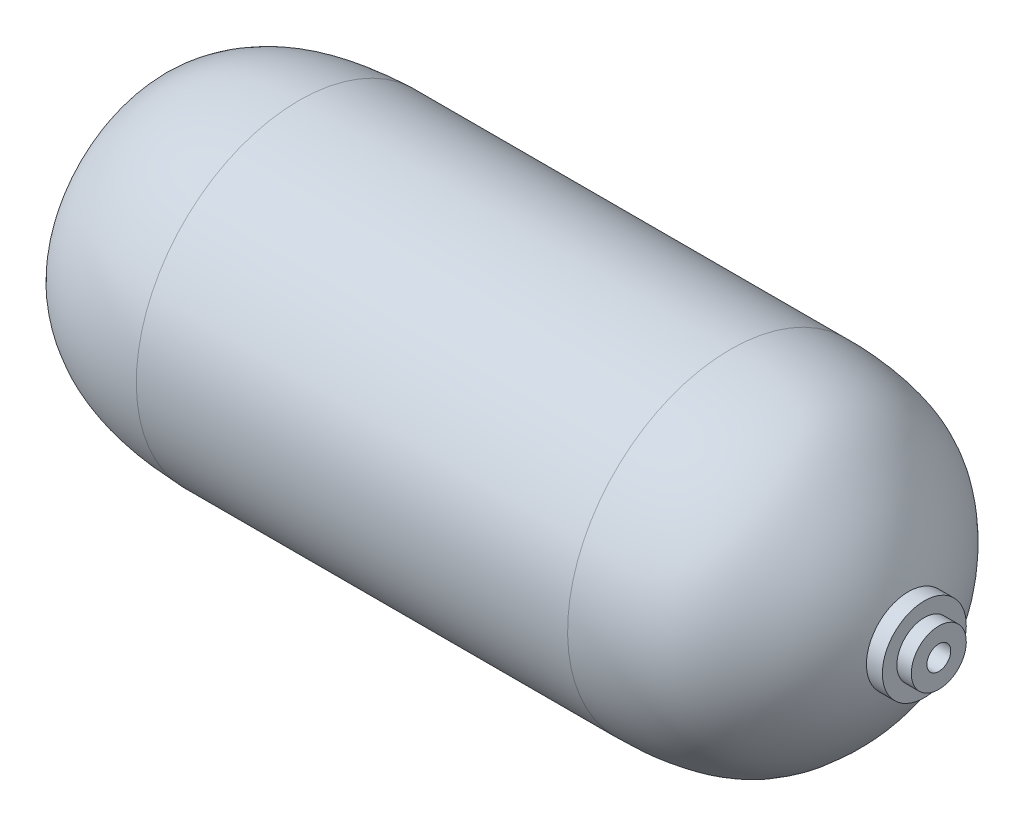
ISO-10303-21;
HEADER;
FILE_DESCRIPTION(('STEP AP214'),'2;1');
FILE_NAME('part.step','',(''),(''),'','','');
FILE_SCHEMA(('AUTOMOTIVE_DESIGN { 1 0 10303 214 1 1 1 1 }'));
ENDSEC;
DATA;
#1=APPLICATION_CONTEXT('core data for automotive mechanical design processes');
#2=APPLICATION_PROTOCOL_DEFINITION('international standard','automotive_design',2000,#1);
#3=PRODUCT_CONTEXT('',#1,'mechanical');
#4=PRODUCT('Part','Part','',(#3));
#5=PRODUCT_RELATED_PRODUCT_CATEGORY('part','',(#4));
#6=PRODUCT_DEFINITION_FORMATION('','',#4);
#7=PRODUCT_DEFINITION_CONTEXT('part definition',#1,'design');
#8=PRODUCT_DEFINITION('design','',#6,#7);
#9=PRODUCT_DEFINITION_SHAPE('','',#8);
#10=(LENGTH_UNIT() NAMED_UNIT(*) SI_UNIT(.MILLI.,.METRE.));
#11=(NAMED_UNIT(*) PLANE_ANGLE_UNIT() SI_UNIT($,.RADIAN.));
#12=(NAMED_UNIT(*) SI_UNIT($,.STERADIAN.) SOLID_ANGLE_UNIT());
#13=UNCERTAINTY_MEASURE_WITH_UNIT(LENGTH_MEASURE(1.E-05),#10,'distance_accuracy_value','');
#14=(GEOMETRIC_REPRESENTATION_CONTEXT(3) GLOBAL_UNCERTAINTY_ASSIGNED_CONTEXT((#13)) GLOBAL_UNIT_ASSIGNED_CONTEXT((#10,
#11,#12)) REPRESENTATION_CONTEXT('',''));
#15=CARTESIAN_POINT('',(0.,0.,0.));
#16=DIRECTION('',(0.,0.,1.));
#17=DIRECTION('',(1.,0.,0.));
#18=AXIS2_PLACEMENT_3D('',#15,#16,#17);
#19=CARTESIAN_POINT('',(528.,0.,0.));
#20=DIRECTION('',(1.,0.,0.));
#21=DIRECTION('',(0.,1.,0.));
#22=AXIS2_PLACEMENT_3D('',#19,#20,#21);
#23=PLANE('',#22);
#24=CARTESIAN_POINT('',(528.,0.,0.));
#25=DIRECTION('',(1.,0.,0.));
#26=DIRECTION('',(0.,1.,0.));
#27=AXIS2_PLACEMENT_3D('',#24,#25,#26);
#28=CIRCLE('',#27,8.25);
#29=CARTESIAN_POINT('',(528.,8.25,0.));
#30=VERTEX_POINT('',#29);
#31=EDGE_CURVE('E11',#30,#30,#28,.T.);
#32=ORIENTED_EDGE('',*,*,#31,.T.);
#33=EDGE_LOOP('',(#32));
#34=FACE_BOUND('',#33,.T.);
#35=ADVANCED_FACE('F16',(#34),#23,.T.);
#36=CARTESIAN_POINT('',(542.,0.,0.));
#37=DIRECTION('',(1.,0.,0.));
#38=DIRECTION('',(0.,1.,0.));
#39=AXIS2_PLACEMENT_3D('',#36,#37,#38);
#40=CYLINDRICAL_SURFACE('',#39,8.25);
#41=CARTESIAN_POINT('',(542.,0.,0.));
#42=DIRECTION('',(1.,0.,0.));
#43=DIRECTION('',(0.,1.,0.));
#44=AXIS2_PLACEMENT_3D('',#41,#42,#43);
#45=CIRCLE('',#44,8.25);
#46=CARTESIAN_POINT('',(542.,8.25,0.));
#47=VERTEX_POINT('',#46);
#48=EDGE_CURVE('E128',#47,#47,#45,.T.);
#49=ORIENTED_EDGE('',*,*,#48,.T.);
#50=DIRECTION('',(-1.,0.,0.));
#51=VECTOR('',#50,1.);
#52=CARTESIAN_POINT('',(542.,8.25,0.));
#53=LINE('',#52,#51);
#54=EDGE_CURVE('E19',#47,#30,#53,.T.);
#55=ORIENTED_EDGE('',*,*,#54,.T.);
#56=ORIENTED_EDGE('',*,*,#31,.F.);
#57=ORIENTED_EDGE('',*,*,#54,.F.);
#58=EDGE_LOOP('',(#49,#55,#56,#57));
#59=FACE_BOUND('',#58,.T.);
#60=ADVANCED_FACE('F226',(#59),#40,.F.);
#61=CARTESIAN_POINT('',(542.,0.,0.));
#62=DIRECTION('',(1.,0.,0.));
#63=DIRECTION('',(0.,1.,0.));
#64=AXIS2_PLACEMENT_3D('',#61,#62,#63);
#65=PLANE('',#64);
#66=ORIENTED_EDGE('',*,*,#48,.F.);
#67=EDGE_LOOP('',(#66));
#68=FACE_BOUND('',#67,.T.);
#69=CARTESIAN_POINT('',(542.,0.,0.));
#70=DIRECTION('',(1.,0.,0.));
#71=DIRECTION('',(0.,1.,0.));
#72=AXIS2_PLACEMENT_3D('',#69,#70,#71);
#73=CIRCLE('',#72,19.);
#74=CARTESIAN_POINT('',(542.,19.,0.));
#75=VERTEX_POINT('',#74);
#76=EDGE_CURVE('E100',#75,#75,#73,.T.);
#77=ORIENTED_EDGE('',*,*,#76,.T.);
#78=EDGE_LOOP('',(#77));
#79=FACE_BOUND('',#78,.T.);
#80=ADVANCED_FACE('F134',(#68,#79),#65,.T.);
#81=CARTESIAN_POINT('',(532.,0.,0.));
#82=DIRECTION('',(1.,0.,0.));
#83=DIRECTION('',(0.,1.,0.));
#84=AXIS2_PLACEMENT_3D('',#81,#82,#83);
#85=CYLINDRICAL_SURFACE('',#84,19.);
#86=CARTESIAN_POINT('',(532.,0.,0.));
#87=DIRECTION('',(1.,0.,0.));
#88=DIRECTION('',(0.,1.,0.));
#89=AXIS2_PLACEMENT_3D('',#86,#87,#88);
#90=CIRCLE('',#89,19.);
#91=CARTESIAN_POINT('',(532.,19.,0.));
#92=VERTEX_POINT('',#91);
#93=EDGE_CURVE('E101',#92,#92,#90,.T.);
#94=ORIENTED_EDGE('',*,*,#93,.T.);
#95=DIRECTION('',(1.,0.,0.));
#96=VECTOR('',#95,1.);
#97=CARTESIAN_POINT('',(532.,19.,0.));
#98=LINE('',#97,#96);
#99=EDGE_CURVE('E96',#92,#75,#98,.T.);
#100=ORIENTED_EDGE('',*,*,#99,.T.);
#101=ORIENTED_EDGE('',*,*,#76,.F.);
#102=ORIENTED_EDGE('',*,*,#99,.F.);
#103=EDGE_LOOP('',(#94,#100,#101,#102));
#104=FACE_BOUND('',#103,.T.);
#105=ADVANCED_FACE('F136',(#104),#85,.T.);
#106=CARTESIAN_POINT('',(532.,0.,0.));
#107=DIRECTION('',(1.,0.,0.));
#108=DIRECTION('',(0.,1.,0.));
#109=AXIS2_PLACEMENT_3D('',#106,#107,#108);
#110=PLANE('',#109);
#111=ORIENTED_EDGE('',*,*,#93,.F.);
#112=EDGE_LOOP('',(#111));
#113=FACE_BOUND('',#112,.T.);
#114=CARTESIAN_POINT('',(532.,0.,0.));
#115=DIRECTION('',(1.,0.,0.));
#116=DIRECTION('',(0.,1.,0.));
#117=AXIS2_PLACEMENT_3D('',#114,#115,#116);
#118=CIRCLE('',#117,29.);
#119=CARTESIAN_POINT('',(532.,29.,0.));
#120=VERTEX_POINT('',#119);
#121=EDGE_CURVE('E106',#120,#120,#118,.T.);
#122=ORIENTED_EDGE('',*,*,#121,.T.);
#123=EDGE_LOOP('',(#122));
#124=FACE_BOUND('',#123,.T.);
#125=ADVANCED_FACE('F139',(#113,#124),#110,.T.);
#126=CARTESIAN_POINT('',(521.,0.,0.));
#127=DIRECTION('',(1.,0.,0.));
#128=DIRECTION('',(0.,1.,0.));
#129=AXIS2_PLACEMENT_3D('',#126,#127,#128);
#130=CYLINDRICAL_SURFACE('',#129,29.);
#131=CARTESIAN_POINT('',(521.,0.,0.));
#132=DIRECTION('',(1.,0.,0.));
#133=DIRECTION('',(0.,1.,0.));
#134=AXIS2_PLACEMENT_3D('',#131,#132,#133);
#135=CIRCLE('',#134,29.);
#136=CARTESIAN_POINT('',(521.,29.,0.));
#137=VERTEX_POINT('',#136);
#138=EDGE_CURVE('E91',#137,#137,#135,.T.);
#139=ORIENTED_EDGE('',*,*,#138,.T.);
#140=DIRECTION('',(1.,0.,0.));
#141=VECTOR('',#140,1.);
#142=CARTESIAN_POINT('',(521.,29.,0.));
#143=LINE('',#142,#141);
#144=EDGE_CURVE('E109',#137,#120,#143,.T.);
#145=ORIENTED_EDGE('',*,*,#144,.T.);
#146=ORIENTED_EDGE('',*,*,#121,.F.);
#147=ORIENTED_EDGE('',*,*,#144,.F.);
#148=EDGE_LOOP('',(#139,#145,#146,#147));
#149=FACE_BOUND('',#148,.T.);
#150=ADVANCED_FACE('F142',(#149),#130,.T.);
#151=CARTESIAN_POINT('',(398.,112.5,0.));
#152=CARTESIAN_POINT('',(410.03078388992,112.58858139805,0.));
#153=CARTESIAN_POINT('',(433.04807654803,111.09635169693,0.));
#154=CARTESIAN_POINT('',(465.97158894435,101.67106049315,0.));
#155=CARTESIAN_POINT('',(489.76059551619,80.564626141012,0.));
#156=CARTESIAN_POINT('',(509.06279632744,56.418919503974,0.));
#157=CARTESIAN_POINT('',(517.68608837954,38.454879893494,0.));
#158=CARTESIAN_POINT('',(521.,29.,0.));
#159=(BOUNDED_CURVE() B_SPLINE_CURVE(3,(#151,#152,#153,#154,#155,#156,#157,#158),.UNSPECIFIED.,
.F.,.F.) B_SPLINE_CURVE_WITH_KNOTS((4,1,1,1,1,4),(0.,37.121422386541,67.637811425875,
101.05936136001,130.26552509303,160.23217322057),
.UNSPECIFIED.) CURVE() GEOMETRIC_REPRESENTATION_ITEM() RATIONAL_B_SPLINE_CURVE((1.,1.,1.,1.,1.,
1.,1.,1.)) REPRESENTATION_ITEM(''));
#160=CARTESIAN_POINT('',(0.,0.,0.));
#161=DIRECTION('',(-1.,0.,0.));
#162=AXIS1_PLACEMENT('',#160,#161);
#163=SURFACE_OF_REVOLUTION('',#159,#162);
#164=CARTESIAN_POINT('',(398.,0.,0.));
#165=DIRECTION('',(1.,0.,0.));
#166=DIRECTION('',(0.,1.,0.));
#167=AXIS2_PLACEMENT_3D('',#164,#165,#166);
#168=CIRCLE('',#167,112.5);
#169=CARTESIAN_POINT('',(398.,112.5,0.));
#170=VERTEX_POINT('',#169);
#171=EDGE_CURVE('E105',#170,#170,#168,.T.);
#172=ORIENTED_EDGE('',*,*,#171,.T.);
#173=CARTESIAN_POINT('',(398.,112.5,0.));
#174=CARTESIAN_POINT('',(410.03078388992,112.58858139805,0.));
#175=CARTESIAN_POINT('',(433.04807654803,111.09635169693,0.));
#176=CARTESIAN_POINT('',(465.97158894435,101.67106049315,0.));
#177=CARTESIAN_POINT('',(489.76059551619,80.564626141012,0.));
#178=CARTESIAN_POINT('',(509.06279632744,56.418919503974,0.));
#179=CARTESIAN_POINT('',(517.68608837954,38.454879893494,0.));
#180=CARTESIAN_POINT('',(521.,29.,0.));
#181=(BOUNDED_CURVE() B_SPLINE_CURVE(3,(#173,#174,#175,#176,#177,#178,#179,#180),.UNSPECIFIED.,
.F.,.F.) B_SPLINE_CURVE_WITH_KNOTS((4,1,1,1,1,4),(0.,37.121422386541,67.637811425875,
101.05936136001,130.26552509303,160.23217322057),
.UNSPECIFIED.) CURVE() GEOMETRIC_REPRESENTATION_ITEM() RATIONAL_B_SPLINE_CURVE((1.,1.,1.,1.,1.,
1.,1.,1.)) REPRESENTATION_ITEM(''));
#182=EDGE_CURVE('E112',#170,#137,#181,.T.);
#183=ORIENTED_EDGE('',*,*,#182,.T.);
#184=ORIENTED_EDGE('',*,*,#138,.F.);
#185=ORIENTED_EDGE('',*,*,#182,.F.);
#186=EDGE_LOOP('',(#172,#183,#184,#185));
#187=FACE_BOUND('',#186,.T.);
#188=ADVANCED_FACE('F216',(#187),#163,.F.);
#189=CARTESIAN_POINT('',(100.,0.,0.));
#190=DIRECTION('',(1.,0.,0.));
#191=DIRECTION('',(0.,1.,0.));
#192=AXIS2_PLACEMENT_3D('',#189,#190,#191);
#193=CYLINDRICAL_SURFACE('',#192,112.5);
#194=CARTESIAN_POINT('',(100.,0.,0.));
#195=DIRECTION('',(1.,0.,0.));
#196=DIRECTION('',(0.,1.,0.));
#197=AXIS2_PLACEMENT_3D('',#194,#195,#196);
#198=CIRCLE('',#197,112.5);
#199=CARTESIAN_POINT('',(100.,112.5,0.));
#200=VERTEX_POINT('',#199);
#201=EDGE_CURVE('E78',#200,#200,#198,.T.);
#202=ORIENTED_EDGE('',*,*,#201,.T.);
#203=DIRECTION('',(1.,0.,0.));
#204=VECTOR('',#203,1.);
#205=CARTESIAN_POINT('',(100.,112.5,0.));
#206=LINE('',#205,#204);
#207=EDGE_CURVE('E85',#200,#170,#206,.T.);
#208=ORIENTED_EDGE('',*,*,#207,.T.);
#209=ORIENTED_EDGE('',*,*,#171,.F.);
#210=ORIENTED_EDGE('',*,*,#207,.F.);
#211=EDGE_LOOP('',(#202,#208,#209,#210));
#212=FACE_BOUND('',#211,.T.);
#213=ADVANCED_FACE('F197',(#212),#193,.T.);
#214=CARTESIAN_POINT('',(0.,69.,0.));
#215=CARTESIAN_POINT('',(0.8180180842,72.3089105897,0.));
#216=CARTESIAN_POINT('',(4.357611651735,80.010722624957,0.));
#217=CARTESIAN_POINT('',(16.383840723784,90.889591087721,0.));
#218=CARTESIAN_POINT('',(35.83261352121,101.88188896638,0.));
#219=CARTESIAN_POINT('',(64.69005719952,110.15196708927,0.));
#220=CARTESIAN_POINT('',(87.512859561727,112.00838302962,0.));
#221=CARTESIAN_POINT('',(100.,112.5,0.));
#222=(BOUNDED_CURVE() B_SPLINE_CURVE(3,(#214,#215,#216,#217,#218,#219,#220,#221),.UNSPECIFIED.,
.F.,.F.) B_SPLINE_CURVE_WITH_KNOTS((4,1,1,1,1,4),(0.,9.848857801796,25.4052069879,47.359705388,
76.621455164799,114.83140151388),
.UNSPECIFIED.) CURVE() GEOMETRIC_REPRESENTATION_ITEM() RATIONAL_B_SPLINE_CURVE((1.,1.,1.,1.,1.,
1.,1.,1.)) REPRESENTATION_ITEM(''));
#223=CARTESIAN_POINT('',(0.,0.,0.));
#224=DIRECTION('',(-1.,0.,0.));
#225=AXIS1_PLACEMENT('',#223,#224);
#226=SURFACE_OF_REVOLUTION('',#222,#225);
#227=CARTESIAN_POINT('',(0.,0.,0.));
#228=DIRECTION('',(1.,0.,0.));
#229=DIRECTION('',(0.,1.,0.));
#230=AXIS2_PLACEMENT_3D('',#227,#228,#229);
#231=CIRCLE('',#230,69.);
#232=CARTESIAN_POINT('',(0.,69.,0.));
#233=VERTEX_POINT('',#232);
#234=EDGE_CURVE('E76',#233,#233,#231,.T.);
#235=ORIENTED_EDGE('',*,*,#234,.T.);
#236=CARTESIAN_POINT('',(0.,69.,0.));
#237=CARTESIAN_POINT('',(0.8180180842,72.3089105897,0.));
#238=CARTESIAN_POINT('',(4.357611651735,80.010722624957,0.));
#239=CARTESIAN_POINT('',(16.383840723784,90.889591087721,0.));
#240=CARTESIAN_POINT('',(35.83261352121,101.88188896638,0.));
#241=CARTESIAN_POINT('',(64.69005719952,110.15196708927,0.));
#242=CARTESIAN_POINT('',(87.512859561727,112.00838302962,0.));
#243=CARTESIAN_POINT('',(100.,112.5,0.));
#244=(BOUNDED_CURVE() B_SPLINE_CURVE(3,(#236,#237,#238,#239,#240,#241,#242,#243),.UNSPECIFIED.,
.F.,.F.) B_SPLINE_CURVE_WITH_KNOTS((4,1,1,1,1,4),(0.,9.848857801796,25.4052069879,47.359705388,
76.621455164799,114.83140151388),
.UNSPECIFIED.) CURVE() GEOMETRIC_REPRESENTATION_ITEM() RATIONAL_B_SPLINE_CURVE((1.,1.,1.,1.,1.,
1.,1.,1.)) REPRESENTATION_ITEM(''));
#245=EDGE_CURVE('E73',#233,#200,#244,.T.);
#246=ORIENTED_EDGE('',*,*,#245,.T.);
#247=ORIENTED_EDGE('',*,*,#201,.F.);
#248=ORIENTED_EDGE('',*,*,#245,.F.);
#249=EDGE_LOOP('',(#235,#246,#247,#248));
#250=FACE_BOUND('',#249,.T.);
#251=ADVANCED_FACE('F74',(#250),#226,.F.);
#252=CARTESIAN_POINT('',(0.,0.,0.));
#253=DIRECTION('',(1.,0.,0.));
#254=DIRECTION('',(0.,1.,0.));
#255=AXIS2_PLACEMENT_3D('',#252,#253,#254);
#256=PLANE('',#255);
#257=ORIENTED_EDGE('',*,*,#234,.F.);
#258=EDGE_LOOP('',(#257));
#259=FACE_BOUND('',#258,.T.);
#260=ADVANCED_FACE('F182',(#259),#256,.F.);
#261=CLOSED_SHELL('',(#35,#60,#80,#105,#125,#150,#188,#213,#251,#260));
#262=MANIFOLD_SOLID_BREP('B1',#261);
#263=ADVANCED_BREP_SHAPE_REPRESENTATION('',(#18,#262),#14);
#264=SHAPE_DEFINITION_REPRESENTATION(#9,#263);
ENDSEC;
END-ISO-10303-21;
